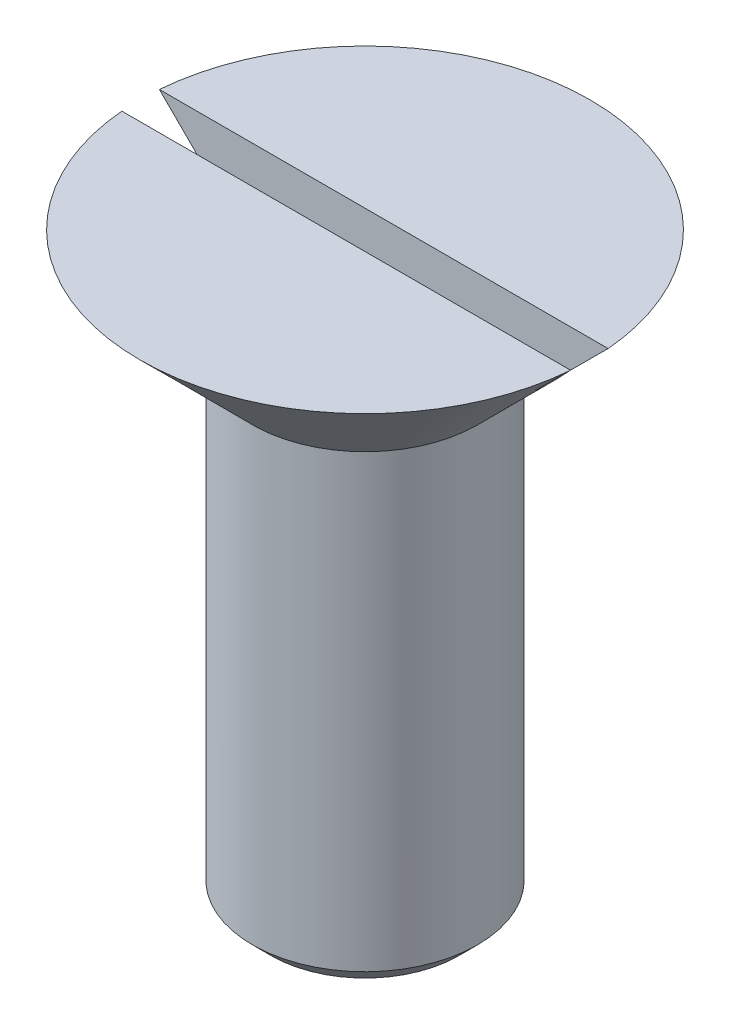
ISO-10303-21;
HEADER;
FILE_DESCRIPTION(('STEP AP214'),'2;1');
FILE_NAME('part.step','',(''),(''),'','','');
FILE_SCHEMA(('AUTOMOTIVE_DESIGN { 1 0 10303 214 1 1 1 1 }'));
ENDSEC;
DATA;
#1=APPLICATION_CONTEXT('core data for automotive mechanical design processes');
#2=APPLICATION_PROTOCOL_DEFINITION('international standard','automotive_design',2000,#1);
#3=PRODUCT_CONTEXT('',#1,'mechanical');
#4=PRODUCT('Part','Part','',(#3));
#5=PRODUCT_RELATED_PRODUCT_CATEGORY('part','',(#4));
#6=PRODUCT_DEFINITION_FORMATION('','',#4);
#7=PRODUCT_DEFINITION_CONTEXT('part definition',#1,'design');
#8=PRODUCT_DEFINITION('design','',#6,#7);
#9=PRODUCT_DEFINITION_SHAPE('','',#8);
#10=(LENGTH_UNIT() NAMED_UNIT(*) SI_UNIT(.MILLI.,.METRE.));
#11=(NAMED_UNIT(*) PLANE_ANGLE_UNIT() SI_UNIT($,.RADIAN.));
#12=(NAMED_UNIT(*) SI_UNIT($,.STERADIAN.) SOLID_ANGLE_UNIT());
#13=UNCERTAINTY_MEASURE_WITH_UNIT(LENGTH_MEASURE(1.E-05),#10,'distance_accuracy_value','');
#14=(GEOMETRIC_REPRESENTATION_CONTEXT(3) GLOBAL_UNCERTAINTY_ASSIGNED_CONTEXT((#13)) GLOBAL_UNIT_ASSIGNED_CONTEXT((#10,
#11,#12)) REPRESENTATION_CONTEXT('',''));
#15=CARTESIAN_POINT('',(0.,0.,0.));
#16=DIRECTION('',(0.,0.,1.));
#17=DIRECTION('',(1.,0.,0.));
#18=AXIS2_PLACEMENT_3D('',#15,#16,#17);
#19=CARTESIAN_POINT('',(1.,31.,0.));
#20=DIRECTION('',(0.,1.,0.));
#21=DIRECTION('',(-1.,0.,0.));
#22=AXIS2_PLACEMENT_3D('',#19,#20,#21);
#23=PLANE('',#22);
#24=CARTESIAN_POINT('',(0.,31.,0.));
#25=DIRECTION('',(0.,-1.,0.));
#26=DIRECTION('',(1.,0.,0.));
#27=AXIS2_PLACEMENT_3D('',#24,#25,#26);
#28=CIRCLE('',#27,11.9999999999999);
#29=CARTESIAN_POINT('',(-11.9582607431013,31.,-1.));
#30=VERTEX_POINT('',#29);
#31=CARTESIAN_POINT('',(11.9582607431013,31.,-1.));
#32=VERTEX_POINT('',#31);
#33=EDGE_CURVE('E92',#30,#32,#28,.T.);
#34=ORIENTED_EDGE('',*,*,#33,.F.);
#35=DIRECTION('',(1.,0.,0.));
#36=VECTOR('',#35,1.);
#37=CARTESIAN_POINT('',(-11.9999999999999,31.,-1.));
#38=LINE('',#37,#36);
#39=EDGE_CURVE('E55',#30,#32,#38,.T.);
#40=ORIENTED_EDGE('',*,*,#39,.T.);
#41=EDGE_LOOP('',(#34,#40));
#42=FACE_BOUND('',#41,.T.);
#43=ADVANCED_FACE('F39',(#42),#23,.T.);
#44=DIRECTION('',(1.,0.,0.));
#45=VECTOR('',#44,1.);
#46=CARTESIAN_POINT('',(-11.9999999999999,31.,1.));
#47=LINE('',#46,#45);
#48=CARTESIAN_POINT('',(-11.9582607431013,31.,1.));
#49=VERTEX_POINT('',#48);
#50=CARTESIAN_POINT('',(11.9582607431013,31.,1.));
#51=VERTEX_POINT('',#50);
#52=EDGE_CURVE('E93',#49,#51,#47,.T.);
#53=ORIENTED_EDGE('',*,*,#52,.F.);
#54=EDGE_CURVE('E98',#51,#49,#28,.T.);
#55=ORIENTED_EDGE('',*,*,#54,.F.);
#56=EDGE_LOOP('',(#53,#55));
#57=FACE_BOUND('',#56,.T.);
#58=ADVANCED_FACE('F121',(#57),#23,.T.);
#59=CARTESIAN_POINT('',(0.,25.,0.));
#60=DIRECTION('',(0.,1.,0.));
#61=DIRECTION('',(-1.,0.,0.));
#62=AXIS2_PLACEMENT_3D('',#59,#60,#61);
#63=CONICAL_SURFACE('',#62,6.,0.785398163397439);
#64=CARTESIAN_POINT('',(11.9589631862464,31.0007,1.));
#65=CARTESIAN_POINT('',(11.5321503490817,30.5753848647634,1.));
#66=CARTESIAN_POINT('',(11.105270961977,30.1501364321051,1.));
#67=CARTESIAN_POINT('',(10.2512643471975,29.2998425981257,1.));
#68=CARTESIAN_POINT('',(9.82413710743326,28.8747972089477,1.));
#69=CARTESIAN_POINT('',(8.96901408307325,28.0244761019356,1.));
#70=CARTESIAN_POINT('',(8.54101788918412,27.5992007955806,1.));
#71=CARTESIAN_POINT('',(7.68455465560918,26.7491692883159,1.));
#72=CARTESIAN_POINT('',(7.25608764170478,26.3244130614336,1.));
#73=CARTESIAN_POINT('',(6.42274256348553,25.4998551682343,1.));
#74=CARTESIAN_POINT('',(6.01790913164653,25.1000084430067,1.));
#75=CARTESIAN_POINT('',(5.40965503219343,24.5011937981514,1.));
#76=CARTESIAN_POINT('',(5.20672027513101,24.3017324434182,1.));
#77=CARTESIAN_POINT('',(4.80039319389171,23.9032820093985,1.));
#78=CARTESIAN_POINT('',(4.59700087652906,23.7042929231683,1.));
#79=CARTESIAN_POINT('',(4.18970376825761,23.3071541588774,1.));
#80=CARTESIAN_POINT('',(3.98579949304573,23.10900395213,1.));
#81=CARTESIAN_POINT('',(3.57696156274983,22.7137420350831,1.));
#82=CARTESIAN_POINT('',(3.37202784947418,22.5166303848109,1.));
#83=CARTESIAN_POINT('',(3.06338188896098,22.2223233798266,1.));
#84=CARTESIAN_POINT('',(2.96030622479716,22.1244608051108,1.));
#85=CARTESIAN_POINT('',(2.75358292465406,21.929342066822,1.));
#86=CARTESIAN_POINT('',(2.64993529242695,21.8320858992799,1.));
#87=CARTESIAN_POINT('',(2.44186757767961,21.6384219809864,1.));
#88=CARTESIAN_POINT('',(2.33744756749704,21.5420141525896,1.));
#89=CARTESIAN_POINT('',(2.12750463341793,21.3504083717209,1.));
#90=CARTESIAN_POINT('',(2.021981749103,21.2552103760984,1.));
#91=CARTESIAN_POINT('',(1.88595698884807,21.1346308703326,1.));
#92=CARTESIAN_POINT('',(1.85621343318058,21.1083936763726,1.));
#93=CARTESIAN_POINT('',(1.79657925620902,21.0560864149772,1.));
#94=CARTESIAN_POINT('',(1.76668863349266,21.0300163491523,1.));
#95=CARTESIAN_POINT('',(1.67676385573667,20.9520859360664,1.));
#96=CARTESIAN_POINT('',(1.61648217829608,20.900510162753,1.));
#97=CARTESIAN_POINT('',(1.49447915824156,20.7978787167766,1.));
#98=CARTESIAN_POINT('',(1.43274953841776,20.7468328551141,1.));
#99=CARTESIAN_POINT('',(1.30814927219097,20.6461785341887,1.));
#100=CARTESIAN_POINT('',(1.24527892142898,20.5965697109067,1.));
#101=CARTESIAN_POINT('',(1.11730740504752,20.4988807961086,1.));
#102=CARTESIAN_POINT('',(1.05218978799871,20.4508221112832,1.));
#103=CARTESIAN_POINT('',(0.919645579491801,20.357760217164,1.));
#104=CARTESIAN_POINT('',(0.852216107559325,20.3127610446474,1.));
#105=CARTESIAN_POINT('',(0.714907331680606,20.228080535901,1.));
#106=CARTESIAN_POINT('',(0.645056206831706,20.1883541653584,1.));
#107=CARTESIAN_POINT('',(0.501381467271969,20.1169265583072,1.));
#108=CARTESIAN_POINT('',(0.427570425445846,20.0852015565004,1.));
#109=CARTESIAN_POINT('',(0.316872873513049,20.0484955248653,1.));
#110=CARTESIAN_POINT('',(0.281710836766211,20.0383486342315,1.));
#111=CARTESIAN_POINT('',(0.210587947145432,20.0213499097368,1.));
#112=CARTESIAN_POINT('',(0.174627235157746,20.0144974994843,1.));
#113=CARTESIAN_POINT('',(0.1023964592244,20.0045968661038,1.));
#114=CARTESIAN_POINT('',(0.0661295767294963,20.0015259103661,1.));
#115=CARTESIAN_POINT('',(-0.00652491738479207,19.9993620713506,1.));
#116=CARTESIAN_POINT('',(-0.0429125258642427,20.0002690854088,1.));
#117=CARTESIAN_POINT('',(-0.115256930448696,20.0059755585235,1.));
#118=CARTESIAN_POINT('',(-0.151214730031683,20.0107626018368,1.));
#119=CARTESIAN_POINT('',(-0.222488147599307,20.0238513268036,1.));
#120=CARTESIAN_POINT('',(-0.257803460746127,20.0321546336667,1.));
#121=CARTESIAN_POINT('',(-0.327844751891867,20.0518280289704,1.));
#122=CARTESIAN_POINT('',(-0.362564204273216,20.063220963256,1.));
#123=CARTESIAN_POINT('',(-0.431068497778883,20.088488325405,1.));
#124=CARTESIAN_POINT('',(-0.464853458320118,20.1023624344964,1.));
#125=CARTESIAN_POINT('',(-0.554241933320532,20.1422167519618,1.));
#126=CARTESIAN_POINT('',(-0.609034391756173,20.170006566008,1.));
#127=CARTESIAN_POINT('',(-0.71653273489548,20.2293950686134,1.));
#128=CARTESIAN_POINT('',(-0.76923632269035,20.2609978034767,1.));
#129=CARTESIAN_POINT('',(-0.873135265150047,20.3269327271385,1.));
#130=CARTESIAN_POINT('',(-0.924325096007479,20.3612735418752,1.));
#131=CARTESIAN_POINT('',(-1.02539908496381,20.4318294602705,1.));
#132=CARTESIAN_POINT('',(-1.07528298942097,20.4680449240229,1.));
#133=CARTESIAN_POINT('',(-1.17446119270038,20.5421625149718,1.));
#134=CARTESIAN_POINT('',(-1.22374646290207,20.5800766638774,1.));
#135=CARTESIAN_POINT('',(-1.32150387611913,20.6569434608962,1.));
#136=CARTESIAN_POINT('',(-1.3699759499509,20.6958961966458,1.));
#137=CARTESIAN_POINT('',(-1.46616010487104,20.7745025867684,1.));
#138=CARTESIAN_POINT('',(-1.51387368272749,20.8141544144321,1.));
#139=CARTESIAN_POINT('',(-1.60877817553046,20.8940735487963,1.));
#140=CARTESIAN_POINT('',(-1.65596911118309,20.9343408309622,1.));
#141=CARTESIAN_POINT('',(-1.7949036026878,21.0541414207461,1.));
#142=CARTESIAN_POINT('',(-1.88605251845559,21.1343638788316,1.));
#143=CARTESIAN_POINT('',(-2.06724501129127,21.2960493477795,1.));
#144=CARTESIAN_POINT('',(-2.15728853739771,21.3775124154523,1.));
#145=CARTESIAN_POINT('',(-2.33658958930621,21.5413228753087,1.));
#146=CARTESIAN_POINT('',(-2.4258470036209,21.6236703893639,1.));
#147=CARTESIAN_POINT('',(-2.60376927818462,21.7890036209769,1.));
#148=CARTESIAN_POINT('',(-2.69243413298669,21.8719893443863,1.));
#149=CARTESIAN_POINT('',(-2.95796917179988,22.1218510177773,1.));
#150=CARTESIAN_POINT('',(-3.13416980871137,22.289438039276,1.));
#151=CARTESIAN_POINT('',(-3.48546678495243,22.6257328641538,1.));
#152=CARTESIAN_POINT('',(-3.66056321432307,22.7944405737828,1.));
#153=CARTESIAN_POINT('',(-4.00844067237698,23.1310638548675,1.));
#154=CARTESIAN_POINT('',(-4.18122826478266,23.2989726466237,1.));
#155=CARTESIAN_POINT('',(-4.52631185683186,23.6353015247814,1.));
#156=CARTESIAN_POINT('',(-4.69860784591786,23.8037216220057,1.));
#157=CARTESIAN_POINT('',(-5.21480572849407,24.3093650626119,1.));
#158=CARTESIAN_POINT('',(-5.55817872920346,24.6471281342173,1.));
#159=CARTESIAN_POINT('',(-6.40498697902631,25.4820359971098,1.));
#160=CARTESIAN_POINT('',(-6.90796784784921,25.9796410617064,1.));
#161=CARTESIAN_POINT('',(-7.91315078034873,26.9758113686599,1.));
#162=CARTESIAN_POINT('',(-8.41535269315682,27.4743767631281,1.));
#163=CARTESIAN_POINT('',(-9.42469055606753,28.4774237617352,1.));
#164=CARTESIAN_POINT('',(-9.93182098623054,28.9819109188122,1.));
#165=CARTESIAN_POINT('',(-10.94564952213,29.9911378516696,1.));
#166=CARTESIAN_POINT('',(-11.4523476890589,30.4958775659715,1.));
#167=CARTESIAN_POINT('',(-11.9589631862464,31.0007,1.));
#168=B_SPLINE_CURVE_WITH_KNOTS('',3,(#64,#65,#66,#67,#68,#69,#70,#71,#72,#73,#74,#75,#76,#77,
#78,#79,#80,#81,#82,#83,#84,#85,#86,#87,#88,#89,#90,#91,#92,#93,#94,#95,#96,#97,#98,#99,#100,
#101,#102,#103,#104,#105,#106,#107,#108,#109,#110,#111,#112,#113,#114,#115,#116,#117,#118,#119,
#120,#121,#122,#123,#124,#125,#126,#127,#128,#129,#130,#131,#132,#133,#134,#135,#136,#137,#138,
#139,#140,#141,#142,#143,#144,#145,#146,#147,#148,#149,#150,#151,#152,#153,#154,#155,#156,#157,
#158,#159,#160,#161,#162,#163,#164,#165,#166,#167),.UNSPECIFIED.,.F.,.F.,(4,2,2,2,2,2,2,2,2,2,2,
2,2,2,2,2,2,2,2,2,2,2,2,2,2,2,2,2,2,2,2,2,2,2,2,2,2,2,2,2,2,2,2,2,2,2,2,2,2,2,2,4),(0.,
1.80763927120908,3.61537571497556,5.42544681865976,7.23542330658035,8.94243841281206,
9.79608079988655,10.6497105571277,11.5026825015962,12.355703217609,12.7820993805593,
13.2084927496314,13.6348466777674,14.061185356463,14.1801706283547,14.2991570451083,
14.537151502648,14.7774409046697,15.0176688965649,15.2604085851314,15.5034625712838,
15.7442848475925,15.9843831900485,16.0940449506421,16.2036875181838,16.3126676882747,
16.4216450458046,16.5302750559129,16.638955329471,16.7484622348293,16.8579550812475,
17.0420186381002,17.226279271829,17.4111452539313,17.5960468789236,17.7825727491159,
17.9691144085483,18.1552252135811,18.3413286186766,18.7055806491539,19.0698494100369,
19.4341690259529,19.7984919861898,20.5279944300237,21.2574365977729,21.9802352512057,
22.703049312117,24.1480032749967,26.270595215362,28.3935567719478,30.5395288663335,
32.6851163588375),.UNSPECIFIED.);
#169=CARTESIAN_POINT('',(9.94987437106612,29.,1.));
#170=VERTEX_POINT('',#169);
#171=EDGE_CURVE('E63',#51,#170,#168,.T.);
#172=ORIENTED_EDGE('',*,*,#171,.F.);
#173=ORIENTED_EDGE('',*,*,#54,.T.);
#174=CARTESIAN_POINT('',(-9.94987437106613,29.,1.));
#175=VERTEX_POINT('',#174);
#176=EDGE_CURVE('E87',#175,#49,#168,.T.);
#177=ORIENTED_EDGE('',*,*,#176,.F.);
#178=CARTESIAN_POINT('',(0.,29.,0.));
#179=DIRECTION('',(0.,-1.,0.));
#180=DIRECTION('',(0.,0.,-1.));
#181=AXIS2_PLACEMENT_3D('',#178,#179,#180);
#182=CIRCLE('',#181,9.99999999999993);
#183=CARTESIAN_POINT('',(-9.94987437106613,29.,-1.));
#184=VERTEX_POINT('',#183);
#185=EDGE_CURVE('E103',#184,#175,#182,.F.);
#186=ORIENTED_EDGE('',*,*,#185,.F.);
#187=CARTESIAN_POINT('',(11.9589631862464,31.0007,-1.));
#188=CARTESIAN_POINT('',(11.5321503490817,30.5753848647634,-1.));
#189=CARTESIAN_POINT('',(11.105270961977,30.1501364321051,-1.));
#190=CARTESIAN_POINT('',(10.2512643471975,29.2998425981257,-1.));
#191=CARTESIAN_POINT('',(9.82413710743327,28.8747972089477,-1.));
#192=CARTESIAN_POINT('',(8.96901408307327,28.0244761019356,-0.999999999999999));
#193=CARTESIAN_POINT('',(8.54101788918413,27.5992007955806,-0.999999999999999));
#194=CARTESIAN_POINT('',(7.68455465560919,26.749169288316,-0.999999999999999));
#195=CARTESIAN_POINT('',(7.25608764170479,26.3244130614336,-0.999999999999999));
#196=CARTESIAN_POINT('',(6.42274256348554,25.4998551682344,-0.999999999999999));
#197=CARTESIAN_POINT('',(6.01790913164654,25.1000084430067,-0.999999999999999));
#198=CARTESIAN_POINT('',(5.40965503219344,24.5011937981514,-0.999999999999999));
#199=CARTESIAN_POINT('',(5.20672027513102,24.3017324434183,-0.999999999999999));
#200=CARTESIAN_POINT('',(4.80039319389172,23.9032820093986,-0.999999999999999));
#201=CARTESIAN_POINT('',(4.59700087652906,23.7042929231683,-0.999999999999999));
#202=CARTESIAN_POINT('',(4.18970376825761,23.3071541588774,-0.999999999999999));
#203=CARTESIAN_POINT('',(3.98579949304574,23.10900395213,-0.999999999999999));
#204=CARTESIAN_POINT('',(3.57696156274983,22.7137420350831,-0.999999999999999));
#205=CARTESIAN_POINT('',(3.37202784947418,22.5166303848109,-0.999999999999998));
#206=CARTESIAN_POINT('',(3.06338188896098,22.2223233798266,-0.999999999999998));
#207=CARTESIAN_POINT('',(2.96030622479716,22.1244608051108,-0.999999999999998));
#208=CARTESIAN_POINT('',(2.75358292465406,21.929342066822,-0.999999999999998));
#209=CARTESIAN_POINT('',(2.64993529242695,21.8320858992798,-0.999999999999998));
#210=CARTESIAN_POINT('',(2.44186757767961,21.6384219809864,-0.999999999999998));
#211=CARTESIAN_POINT('',(2.33744756749704,21.5420141525896,-0.999999999999998));
#212=CARTESIAN_POINT('',(2.12750463341793,21.3504083717209,-0.999999999999998));
#213=CARTESIAN_POINT('',(2.021981749103,21.2552103760984,-0.999999999999998));
#214=CARTESIAN_POINT('',(1.88595698884807,21.1346308703326,-0.999999999999998));
#215=CARTESIAN_POINT('',(1.85621343318058,21.1083936763726,-0.999999999999998));
#216=CARTESIAN_POINT('',(1.79657925620903,21.0560864149772,-0.999999999999998));
#217=CARTESIAN_POINT('',(1.76668863349266,21.0300163491523,-0.999999999999998));
#218=CARTESIAN_POINT('',(1.67676385573667,20.9520859360664,-0.999999999999998));
#219=CARTESIAN_POINT('',(1.61648217829608,20.900510162753,-0.999999999999998));
#220=CARTESIAN_POINT('',(1.49447915824156,20.7978787167766,-0.999999999999998));
#221=CARTESIAN_POINT('',(1.43274953841776,20.7468328551141,-0.999999999999998));
#222=CARTESIAN_POINT('',(1.30814927219097,20.6461785341887,-0.999999999999998));
#223=CARTESIAN_POINT('',(1.24527892142898,20.5965697109067,-0.999999999999998));
#224=CARTESIAN_POINT('',(1.11730740504753,20.4988807961086,-0.999999999999998));
#225=CARTESIAN_POINT('',(1.05218978799871,20.4508221112832,-0.999999999999998));
#226=CARTESIAN_POINT('',(0.919645579491804,20.357760217164,-0.999999999999998));
#227=CARTESIAN_POINT('',(0.852216107559327,20.3127610446474,-0.999999999999998));
#228=CARTESIAN_POINT('',(0.714907331680609,20.228080535901,-0.999999999999998));
#229=CARTESIAN_POINT('',(0.645056206831709,20.1883541653584,-0.999999999999998));
#230=CARTESIAN_POINT('',(0.501381467271973,20.1169265583072,-0.999999999999998));
#231=CARTESIAN_POINT('',(0.42757042544585,20.0852015565004,-0.999999999999998));
#232=CARTESIAN_POINT('',(0.316872873513053,20.0484955248653,-0.999999999999998));
#233=CARTESIAN_POINT('',(0.281710836766215,20.0383486342315,-0.999999999999998));
#234=CARTESIAN_POINT('',(0.210587947145435,20.0213499097368,-0.999999999999998));
#235=CARTESIAN_POINT('',(0.174627235157751,20.0144974994843,-0.999999999999998));
#236=CARTESIAN_POINT('',(0.102396459224405,20.0045968661038,-0.999999999999998));
#237=CARTESIAN_POINT('',(0.0661295767295005,20.0015259103661,-0.999999999999998));
#238=CARTESIAN_POINT('',(-0.00652491738478824,19.9993620713506,-0.999999999999998));
#239=CARTESIAN_POINT('',(-0.042912525864239,20.0002690854088,-0.999999999999998));
#240=CARTESIAN_POINT('',(-0.115256930448692,20.0059755585235,-0.999999999999998));
#241=CARTESIAN_POINT('',(-0.151214730031679,20.0107626018368,-0.999999999999998));
#242=CARTESIAN_POINT('',(-0.222488147599303,20.0238513268036,-0.999999999999998));
#243=CARTESIAN_POINT('',(-0.257803460746124,20.0321546336667,-0.999999999999998));
#244=CARTESIAN_POINT('',(-0.327844751891865,20.0518280289704,-0.999999999999998));
#245=CARTESIAN_POINT('',(-0.362564204273213,20.063220963256,-0.999999999999998));
#246=CARTESIAN_POINT('',(-0.43106849777888,20.088488325405,-0.999999999999998));
#247=CARTESIAN_POINT('',(-0.464853458320116,20.1023624344964,-0.999999999999998));
#248=CARTESIAN_POINT('',(-0.554241933320529,20.1422167519618,-0.999999999999998));
#249=CARTESIAN_POINT('',(-0.60903439175617,20.170006566008,-0.999999999999998));
#250=CARTESIAN_POINT('',(-0.716532734895476,20.2293950686134,-0.999999999999998));
#251=CARTESIAN_POINT('',(-0.769236322690344,20.2609978034767,-0.999999999999998));
#252=CARTESIAN_POINT('',(-0.873135265150039,20.3269327271385,-0.999999999999998));
#253=CARTESIAN_POINT('',(-0.924325096007471,20.3612735418752,-0.999999999999998));
#254=CARTESIAN_POINT('',(-1.02539908496381,20.4318294602705,-0.999999999999998));
#255=CARTESIAN_POINT('',(-1.07528298942096,20.4680449240229,-0.999999999999998));
#256=CARTESIAN_POINT('',(-1.17446119270036,20.5421625149718,-0.999999999999998));
#257=CARTESIAN_POINT('',(-1.22374646290205,20.5800766638774,-0.999999999999998));
#258=CARTESIAN_POINT('',(-1.32150387611912,20.6569434608962,-0.999999999999998));
#259=CARTESIAN_POINT('',(-1.36997594995088,20.6958961966458,-0.999999999999998));
#260=CARTESIAN_POINT('',(-1.46616010487103,20.7745025867683,-0.999999999999998));
#261=CARTESIAN_POINT('',(-1.51387368272748,20.8141544144321,-0.999999999999998));
#262=CARTESIAN_POINT('',(-1.60877817553044,20.8940735487963,-0.999999999999998));
#263=CARTESIAN_POINT('',(-1.65596911118307,20.9343408309621,-0.999999999999998));
#264=CARTESIAN_POINT('',(-1.79490360268779,21.0541414207461,-0.999999999999998));
#265=CARTESIAN_POINT('',(-1.88605251845558,21.1343638788316,-0.999999999999998));
#266=CARTESIAN_POINT('',(-2.06724501129125,21.2960493477795,-0.999999999999998));
#267=CARTESIAN_POINT('',(-2.15728853739769,21.3775124154523,-0.999999999999998));
#268=CARTESIAN_POINT('',(-2.33658958930619,21.5413228753087,-0.999999999999998));
#269=CARTESIAN_POINT('',(-2.42584700362088,21.6236703893639,-0.999999999999998));
#270=CARTESIAN_POINT('',(-2.6037692781846,21.7890036209769,-0.999999999999998));
#271=CARTESIAN_POINT('',(-2.69243413298667,21.8719893443863,-0.999999999999998));
#272=CARTESIAN_POINT('',(-2.95796917179986,22.1218510177773,-0.999999999999998));
#273=CARTESIAN_POINT('',(-3.13416980871134,22.289438039276,-0.999999999999998));
#274=CARTESIAN_POINT('',(-3.4854667849524,22.6257328641538,-0.999999999999998));
#275=CARTESIAN_POINT('',(-3.66056321432304,22.7944405737827,-0.999999999999999));
#276=CARTESIAN_POINT('',(-4.00844067237694,23.1310638548675,-0.999999999999999));
#277=CARTESIAN_POINT('',(-4.18122826478263,23.2989726466237,-0.999999999999999));
#278=CARTESIAN_POINT('',(-4.52631185683182,23.6353015247814,-0.999999999999999));
#279=CARTESIAN_POINT('',(-4.69860784591782,23.8037216220056,-0.999999999999999));
#280=CARTESIAN_POINT('',(-5.21480572849403,24.3093650626118,-0.999999999999999));
#281=CARTESIAN_POINT('',(-5.55817872920341,24.6471281342172,-0.999999999999999));
#282=CARTESIAN_POINT('',(-6.40498697902626,25.4820359971098,-0.999999999999999));
#283=CARTESIAN_POINT('',(-6.90796784784917,25.9796410617063,-0.999999999999999));
#284=CARTESIAN_POINT('',(-7.9131507803487,26.9758113686598,-0.999999999999999));
#285=CARTESIAN_POINT('',(-8.41535269315679,27.474376763128,-0.999999999999999));
#286=CARTESIAN_POINT('',(-9.42469055606751,28.4774237617352,-1.));
#287=CARTESIAN_POINT('',(-9.93182098623052,28.9819109188122,-1.));
#288=CARTESIAN_POINT('',(-10.94564952213,29.9911378516696,-1.));
#289=CARTESIAN_POINT('',(-11.4523476890589,30.4958775659715,-1.));
#290=CARTESIAN_POINT('',(-11.9589631862464,31.0007,-1.));
#291=B_SPLINE_CURVE_WITH_KNOTS('',3,(#187,#188,#189,#190,#191,#192,#193,#194,#195,#196,#197,
#198,#199,#200,#201,#202,#203,#204,#205,#206,#207,#208,#209,#210,#211,#212,#213,#214,#215,#216,
#217,#218,#219,#220,#221,#222,#223,#224,#225,#226,#227,#228,#229,#230,#231,#232,#233,#234,#235,
#236,#237,#238,#239,#240,#241,#242,#243,#244,#245,#246,#247,#248,#249,#250,#251,#252,#253,#254,
#255,#256,#257,#258,#259,#260,#261,#262,#263,#264,#265,#266,#267,#268,#269,#270,#271,#272,#273,
#274,#275,#276,#277,#278,#279,#280,#281,#282,#283,#284,#285,#286,#287,#288,#289,#290),
.UNSPECIFIED.,.F.,.F.,(4,2,2,2,2,2,2,2,2,2,2,2,2,2,2,2,2,2,2,2,2,2,2,2,2,2,2,2,2,2,2,2,2,2,2,2,
2,2,2,2,2,2,2,2,2,2,2,2,2,2,2,4),(0.,1.80763927120907,3.61537571497555,5.42544681865975,
7.23542330658034,8.94243841281205,9.79608079988653,10.6497105571277,11.5026825015962,
12.355703217609,12.7820993805593,13.2084927496314,13.6348466777674,14.061185356463,
14.1801706283547,14.2991570451083,14.537151502648,14.7774409046697,15.0176688965649,
15.2604085851314,15.5034625712838,15.7442848475925,15.9843831900485,16.0940449506421,
16.2036875181838,16.3126676882747,16.4216450458046,16.5302750559129,16.638955329471,
16.7484622348293,16.8579550812475,17.0420186381002,17.226279271829,17.4111452539313,
17.5960468789236,17.7825727491158,17.9691144085483,18.1552252135811,18.3413286186766,
18.7055806491539,19.0698494100369,19.4341690259529,19.7984919861898,20.5279944300237,
21.2574365977729,21.9802352512057,22.7030493121169,24.1480032749967,26.270595215362,
28.3935567719478,30.5395288663335,32.6851163588375),.UNSPECIFIED.);
#292=EDGE_CURVE('E88',#184,#30,#291,.T.);
#293=ORIENTED_EDGE('',*,*,#292,.T.);
#294=ORIENTED_EDGE('',*,*,#33,.T.);
#295=CARTESIAN_POINT('',(9.94987437106612,29.,-1.));
#296=VERTEX_POINT('',#295);
#297=EDGE_CURVE('E81',#32,#296,#291,.T.);
#298=ORIENTED_EDGE('',*,*,#297,.T.);
#299=EDGE_CURVE('E146',#170,#296,#182,.F.);
#300=ORIENTED_EDGE('',*,*,#299,.F.);
#301=EDGE_LOOP('',(#172,#173,#177,#186,#293,#294,#298,#300));
#302=FACE_BOUND('',#301,.T.);
#303=CARTESIAN_POINT('',(0.,25.,0.));
#304=DIRECTION('',(0.,-1.,0.));
#305=DIRECTION('',(1.,0.,0.));
#306=AXIS2_PLACEMENT_3D('',#303,#304,#305);
#307=CIRCLE('',#306,6.);
#308=CARTESIAN_POINT('',(6.,25.,0.));
#309=VERTEX_POINT('',#308);
#310=EDGE_CURVE('E99',#309,#309,#307,.T.);
#311=ORIENTED_EDGE('',*,*,#310,.F.);
#312=EDGE_LOOP('',(#311));
#313=FACE_BOUND('',#312,.T.);
#314=ADVANCED_FACE('F95',(#302,#313),#63,.T.);
#315=CARTESIAN_POINT('',(0.,0.,0.));
#316=DIRECTION('',(0.,-1.,0.));
#317=DIRECTION('',(1.,0.,0.));
#318=AXIS2_PLACEMENT_3D('',#315,#316,#317);
#319=CYLINDRICAL_SURFACE('',#318,6.);
#320=CARTESIAN_POINT('',(0.,1.00000000000001,0.));
#321=DIRECTION('',(0.,-1.,0.));
#322=DIRECTION('',(1.,0.,0.));
#323=AXIS2_PLACEMENT_3D('',#320,#321,#322);
#324=CIRCLE('',#323,6.);
#325=CARTESIAN_POINT('',(6.,1.00000000000001,0.));
#326=VERTEX_POINT('',#325);
#327=EDGE_CURVE('E11',#326,#326,#324,.F.);
#328=ORIENTED_EDGE('',*,*,#327,.T.);
#329=EDGE_LOOP('',(#328));
#330=FACE_BOUND('',#329,.T.);
#331=ORIENTED_EDGE('',*,*,#310,.T.);
#332=EDGE_LOOP('',(#331));
#333=FACE_BOUND('',#332,.T.);
#334=ADVANCED_FACE('F130',(#330,#333),#319,.T.);
#335=CARTESIAN_POINT('',(6.,0.,0.));
#336=DIRECTION('',(0.,-1.,0.));
#337=DIRECTION('',(1.,0.,0.));
#338=AXIS2_PLACEMENT_3D('',#335,#336,#337);
#339=PLANE('',#338);
#340=CARTESIAN_POINT('',(0.,0.,0.));
#341=DIRECTION('',(0.,-1.,0.));
#342=DIRECTION('',(1.,0.,0.));
#343=AXIS2_PLACEMENT_3D('',#340,#341,#342);
#344=CIRCLE('',#343,5.);
#345=CARTESIAN_POINT('',(5.,0.,0.));
#346=VERTEX_POINT('',#345);
#347=EDGE_CURVE('E48',#346,#346,#344,.T.);
#348=ORIENTED_EDGE('',*,*,#347,.T.);
#349=EDGE_LOOP('',(#348));
#350=FACE_BOUND('',#349,.T.);
#351=ADVANCED_FACE('F109',(#350),#339,.T.);
#352=CARTESIAN_POINT('',(-11.9999999999999,31.,1.));
#353=DIRECTION('',(0.,0.,1.));
#354=DIRECTION('',(1.,0.,0.));
#355=AXIS2_PLACEMENT_3D('',#352,#353,#354);
#356=PLANE('',#355);
#357=ORIENTED_EDGE('',*,*,#171,.T.);
#358=DIRECTION('',(1.,0.,0.));
#359=VECTOR('',#358,1.);
#360=CARTESIAN_POINT('',(-11.9999999999999,29.,1.));
#361=LINE('',#360,#359);
#362=EDGE_CURVE('E230',#175,#170,#361,.T.);
#363=ORIENTED_EDGE('',*,*,#362,.F.);
#364=ORIENTED_EDGE('',*,*,#176,.T.);
#365=ORIENTED_EDGE('',*,*,#52,.T.);
#366=EDGE_LOOP('',(#357,#363,#364,#365));
#367=FACE_BOUND('',#366,.T.);
#368=ADVANCED_FACE('F147',(#367),#356,.F.);
#369=CARTESIAN_POINT('',(-11.9999999999999,31.,-1.));
#370=DIRECTION('',(0.,0.,1.));
#371=DIRECTION('',(0.,-1.,0.));
#372=AXIS2_PLACEMENT_3D('',#369,#370,#371);
#373=PLANE('',#372);
#374=ORIENTED_EDGE('',*,*,#39,.F.);
#375=ORIENTED_EDGE('',*,*,#292,.F.);
#376=DIRECTION('',(1.,0.,0.));
#377=VECTOR('',#376,1.);
#378=CARTESIAN_POINT('',(-11.9999999999999,29.,-1.));
#379=LINE('',#378,#377);
#380=EDGE_CURVE('E83',#184,#296,#379,.T.);
#381=ORIENTED_EDGE('',*,*,#380,.T.);
#382=ORIENTED_EDGE('',*,*,#297,.F.);
#383=EDGE_LOOP('',(#374,#375,#381,#382));
#384=FACE_BOUND('',#383,.T.);
#385=ADVANCED_FACE('F82',(#384),#373,.T.);
#386=CARTESIAN_POINT('',(1.,29.,0.));
#387=DIRECTION('',(0.,1.,0.));
#388=DIRECTION('',(-1.,0.,0.));
#389=AXIS2_PLACEMENT_3D('',#386,#387,#388);
#390=PLANE('',#389);
#391=ORIENTED_EDGE('',*,*,#185,.T.);
#392=ORIENTED_EDGE('',*,*,#362,.T.);
#393=ORIENTED_EDGE('',*,*,#299,.T.);
#394=ORIENTED_EDGE('',*,*,#380,.F.);
#395=EDGE_LOOP('',(#391,#392,#393,#394));
#396=FACE_BOUND('',#395,.T.);
#397=ADVANCED_FACE('F112',(#396),#390,.T.);
#398=CARTESIAN_POINT('',(0.,0.,0.));
#399=DIRECTION('',(0.,1.,0.));
#400=DIRECTION('',(-1.,0.,0.));
#401=AXIS2_PLACEMENT_3D('',#398,#399,#400);
#402=CONICAL_SURFACE('',#401,5.,0.785398163397445);
#403=ORIENTED_EDGE('',*,*,#327,.F.);
#404=EDGE_LOOP('',(#403));
#405=FACE_BOUND('',#404,.T.);
#406=ORIENTED_EDGE('',*,*,#347,.F.);
#407=EDGE_LOOP('',(#406));
#408=FACE_BOUND('',#407,.T.);
#409=ADVANCED_FACE('F42',(#405,#408),#402,.T.);
#410=CLOSED_SHELL('',(#43,#58,#314,#334,#351,#368,#385,#397,#409));
#411=MANIFOLD_SOLID_BREP('B2',#410);
#412=ADVANCED_BREP_SHAPE_REPRESENTATION('',(#18,#411),#14);
#413=SHAPE_DEFINITION_REPRESENTATION(#9,#412);
ENDSEC;
END-ISO-10303-21;
